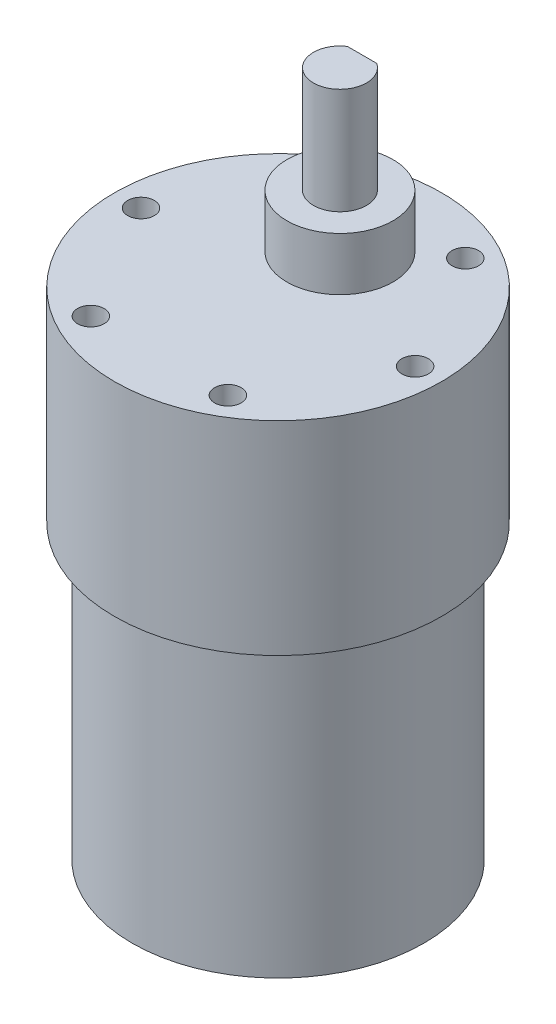
ISO-10303-21;
HEADER;
FILE_DESCRIPTION(('STEP AP214'),'2;1');
FILE_NAME('part.step','',(''),(''),'','','');
FILE_SCHEMA(('AUTOMOTIVE_DESIGN { 1 0 10303 214 1 1 1 1 }'));
ENDSEC;
DATA;
#1=APPLICATION_CONTEXT('core data for automotive mechanical design processes');
#2=APPLICATION_PROTOCOL_DEFINITION('international standard','automotive_design',2000,#1);
#3=PRODUCT_CONTEXT('',#1,'mechanical');
#4=PRODUCT('Part','Part','',(#3));
#5=PRODUCT_RELATED_PRODUCT_CATEGORY('part','',(#4));
#6=PRODUCT_DEFINITION_FORMATION('','',#4);
#7=PRODUCT_DEFINITION_CONTEXT('part definition',#1,'design');
#8=PRODUCT_DEFINITION('design','',#6,#7);
#9=PRODUCT_DEFINITION_SHAPE('','',#8);
#10=(LENGTH_UNIT() NAMED_UNIT(*) SI_UNIT(.MILLI.,.METRE.));
#11=(NAMED_UNIT(*) PLANE_ANGLE_UNIT() SI_UNIT($,.RADIAN.));
#12=(NAMED_UNIT(*) SI_UNIT($,.STERADIAN.) SOLID_ANGLE_UNIT());
#13=UNCERTAINTY_MEASURE_WITH_UNIT(LENGTH_MEASURE(1.E-05),#10,'distance_accuracy_value','');
#14=(GEOMETRIC_REPRESENTATION_CONTEXT(3) GLOBAL_UNCERTAINTY_ASSIGNED_CONTEXT((#13)) GLOBAL_UNIT_ASSIGNED_CONTEXT((#10,
#11,#12)) REPRESENTATION_CONTEXT('',''));
#15=CARTESIAN_POINT('',(0.,0.,0.));
#16=DIRECTION('',(0.,0.,1.));
#17=DIRECTION('',(1.,0.,0.));
#18=AXIS2_PLACEMENT_3D('',#15,#16,#17);
#19=CARTESIAN_POINT('',(0.,-33.,0.));
#20=DIRECTION('',(0.,1.,0.));
#21=DIRECTION('',(0.,0.,1.));
#22=AXIS2_PLACEMENT_3D('',#19,#20,#21);
#23=CYLINDRICAL_SURFACE('',#22,16.5);
#24=CARTESIAN_POINT('',(0.,-33.,0.));
#25=DIRECTION('',(0.,1.,0.));
#26=DIRECTION('',(0.,0.,1.));
#27=AXIS2_PLACEMENT_3D('',#24,#25,#26);
#28=CIRCLE('',#27,16.5);
#29=CARTESIAN_POINT('',(0.,-33.,16.5));
#30=VERTEX_POINT('',#29);
#31=EDGE_CURVE('E11',#30,#30,#28,.T.);
#32=ORIENTED_EDGE('',*,*,#31,.T.);
#33=EDGE_LOOP('',(#32));
#34=FACE_BOUND('',#33,.T.);
#35=CARTESIAN_POINT('',(0.,0.,0.));
#36=DIRECTION('',(0.,1.,0.));
#37=DIRECTION('',(0.,0.,1.));
#38=AXIS2_PLACEMENT_3D('',#35,#36,#37);
#39=CIRCLE('',#38,16.5);
#40=CARTESIAN_POINT('',(0.,0.,16.5));
#41=VERTEX_POINT('',#40);
#42=EDGE_CURVE('E45',#41,#41,#39,.T.);
#43=ORIENTED_EDGE('',*,*,#42,.F.);
#44=EDGE_LOOP('',(#43));
#45=FACE_BOUND('',#44,.T.);
#46=ADVANCED_FACE('F37',(#34,#45),#23,.T.);
#47=CARTESIAN_POINT('',(0.,-33.,0.));
#48=DIRECTION('',(0.,1.,0.));
#49=DIRECTION('',(0.,0.,1.));
#50=AXIS2_PLACEMENT_3D('',#47,#48,#49);
#51=PLANE('',#50);
#52=ORIENTED_EDGE('',*,*,#31,.F.);
#53=EDGE_LOOP('',(#52));
#54=FACE_BOUND('',#53,.T.);
#55=ADVANCED_FACE('F132',(#54),#51,.F.);
#56=CARTESIAN_POINT('',(0.,23.,0.));
#57=DIRECTION('',(0.,-1.,0.));
#58=DIRECTION('',(0.,0.,-1.));
#59=AXIS2_PLACEMENT_3D('',#56,#57,#58);
#60=CYLINDRICAL_SURFACE('',#59,18.5);
#61=CARTESIAN_POINT('',(0.,23.,0.));
#62=DIRECTION('',(0.,1.,0.));
#63=DIRECTION('',(0.,0.,1.));
#64=AXIS2_PLACEMENT_3D('',#61,#62,#63);
#65=CIRCLE('',#64,18.5);
#66=CARTESIAN_POINT('',(0.,23.,18.5));
#67=VERTEX_POINT('',#66);
#68=EDGE_CURVE('E121',#67,#67,#65,.T.);
#69=ORIENTED_EDGE('',*,*,#68,.F.);
#70=EDGE_LOOP('',(#69));
#71=FACE_BOUND('',#70,.T.);
#72=CARTESIAN_POINT('',(0.,0.,0.));
#73=DIRECTION('',(0.,1.,0.));
#74=DIRECTION('',(0.,0.,1.));
#75=AXIS2_PLACEMENT_3D('',#72,#73,#74);
#76=CIRCLE('',#75,18.5);
#77=CARTESIAN_POINT('',(0.,0.,18.5));
#78=VERTEX_POINT('',#77);
#79=EDGE_CURVE('E118',#78,#78,#76,.T.);
#80=ORIENTED_EDGE('',*,*,#79,.T.);
#81=EDGE_LOOP('',(#80));
#82=FACE_BOUND('',#81,.T.);
#83=ADVANCED_FACE('F137',(#71,#82),#60,.T.);
#84=CARTESIAN_POINT('',(0.,23.,0.));
#85=DIRECTION('',(0.,1.,0.));
#86=DIRECTION('',(0.,0.,1.));
#87=AXIS2_PLACEMENT_3D('',#84,#85,#86);
#88=PLANE('',#87);
#89=CARTESIAN_POINT('',(0.,23.,-7.));
#90=DIRECTION('',(0.,1.,0.));
#91=DIRECTION('',(0.,0.,1.));
#92=AXIS2_PLACEMENT_3D('',#89,#90,#91);
#93=CIRCLE('',#92,6.);
#94=CARTESIAN_POINT('',(0.,23.,-0.999999999999999));
#95=VERTEX_POINT('',#94);
#96=EDGE_CURVE('E86',#95,#95,#93,.T.);
#97=ORIENTED_EDGE('',*,*,#96,.F.);
#98=EDGE_LOOP('',(#97));
#99=FACE_BOUND('',#98,.T.);
#100=CARTESIAN_POINT('',(-15.4999999999996,23.,3.41722041537186E-13));
#101=DIRECTION('',(0.,1.,0.));
#102=DIRECTION('',(0.,0.,1.));
#103=AXIS2_PLACEMENT_3D('',#100,#101,#102);
#104=CIRCLE('',#103,1.50000000000039);
#105=CARTESIAN_POINT('',(-15.4999999999996,23.,1.50000000000073));
#106=VERTEX_POINT('',#105);
#107=EDGE_CURVE('E88',#106,#106,#104,.T.);
#108=ORIENTED_EDGE('',*,*,#107,.F.);
#109=EDGE_LOOP('',(#108));
#110=FACE_BOUND('',#109,.T.);
#111=CARTESIAN_POINT('',(-7.74999999999897,23.,13.423393758659));
#112=DIRECTION('',(0.,1.,0.));
#113=DIRECTION('',(0.,0.,1.));
#114=AXIS2_PLACEMENT_3D('',#111,#112,#113);
#115=CIRCLE('',#114,1.50000000000098);
#116=CARTESIAN_POINT('',(-7.74999999999897,23.,14.92339375866));
#117=VERTEX_POINT('',#116);
#118=EDGE_CURVE('E95',#117,#117,#115,.T.);
#119=ORIENTED_EDGE('',*,*,#118,.F.);
#120=EDGE_LOOP('',(#119));
#121=FACE_BOUND('',#120,.T.);
#122=CARTESIAN_POINT('',(7.75000000000124,23.,13.4233937586583));
#123=DIRECTION('',(0.,1.,0.));
#124=DIRECTION('',(0.,0.,1.));
#125=AXIS2_PLACEMENT_3D('',#122,#123,#124);
#126=CIRCLE('',#125,1.50000000000138);
#127=CARTESIAN_POINT('',(7.75000000000124,23.,14.9233937586597));
#128=VERTEX_POINT('',#127);
#129=EDGE_CURVE('E101',#128,#128,#126,.T.);
#130=ORIENTED_EDGE('',*,*,#129,.F.);
#131=EDGE_LOOP('',(#130));
#132=FACE_BOUND('',#131,.T.);
#133=CARTESIAN_POINT('',(15.5000000000008,23.,-9.78365557220674E-13));
#134=DIRECTION('',(0.,1.,0.));
#135=DIRECTION('',(0.,0.,1.));
#136=AXIS2_PLACEMENT_3D('',#133,#134,#135);
#137=CIRCLE('',#136,1.50000000000116);
#138=CARTESIAN_POINT('',(15.5000000000008,23.,1.50000000000018));
#139=VERTEX_POINT('',#138);
#140=EDGE_CURVE('E107',#139,#139,#137,.T.);
#141=ORIENTED_EDGE('',*,*,#140,.F.);
#142=EDGE_LOOP('',(#141));
#143=FACE_BOUND('',#142,.T.);
#144=CARTESIAN_POINT('',(7.7500000000001,23.,-13.4233937586596));
#145=DIRECTION('',(0.,1.,0.));
#146=DIRECTION('',(0.,0.,1.));
#147=AXIS2_PLACEMENT_3D('',#144,#145,#146);
#148=CIRCLE('',#147,1.50000000000048);
#149=CARTESIAN_POINT('',(7.7500000000001,23.,-11.9233937586591));
#150=VERTEX_POINT('',#149);
#151=EDGE_CURVE('E81',#150,#150,#148,.T.);
#152=ORIENTED_EDGE('',*,*,#151,.F.);
#153=EDGE_LOOP('',(#152));
#154=FACE_BOUND('',#153,.T.);
#155=CARTESIAN_POINT('',(-7.7500000000001,23.,-13.423393758659));
#156=DIRECTION('',(0.,1.,0.));
#157=DIRECTION('',(0.,0.,1.));
#158=AXIS2_PLACEMENT_3D('',#155,#156,#157);
#159=CIRCLE('',#158,1.5);
#160=CARTESIAN_POINT('',(-7.7500000000001,23.,-11.923393758659));
#161=VERTEX_POINT('',#160);
#162=EDGE_CURVE('E91',#161,#161,#159,.T.);
#163=ORIENTED_EDGE('',*,*,#162,.F.);
#164=EDGE_LOOP('',(#163));
#165=FACE_BOUND('',#164,.T.);
#166=ORIENTED_EDGE('',*,*,#68,.T.);
#167=EDGE_LOOP('',(#166));
#168=FACE_BOUND('',#167,.T.);
#169=ADVANCED_FACE('F143',(#99,#110,#121,#132,#143,#154,#165,#168),#88,.T.);
#170=CARTESIAN_POINT('',(0.,0.,0.));
#171=DIRECTION('',(0.,1.,0.));
#172=DIRECTION('',(0.,0.,1.));
#173=AXIS2_PLACEMENT_3D('',#170,#171,#172);
#174=PLANE('',#173);
#175=ORIENTED_EDGE('',*,*,#42,.T.);
#176=EDGE_LOOP('',(#175));
#177=FACE_BOUND('',#176,.T.);
#178=ORIENTED_EDGE('',*,*,#79,.F.);
#179=EDGE_LOOP('',(#178));
#180=FACE_BOUND('',#179,.T.);
#181=ADVANCED_FACE('F128',(#177,#180),#174,.F.);
#182=CARTESIAN_POINT('',(-7.7500000000001,20.5,-13.423393758659));
#183=DIRECTION('',(0.,1.,0.));
#184=DIRECTION('',(0.,0.,1.));
#185=AXIS2_PLACEMENT_3D('',#182,#183,#184);
#186=CYLINDRICAL_SURFACE('',#185,1.5);
#187=CARTESIAN_POINT('',(-7.7500000000001,20.5,-13.423393758659));
#188=DIRECTION('',(0.,1.,0.));
#189=DIRECTION('',(0.,0.,1.));
#190=AXIS2_PLACEMENT_3D('',#187,#188,#189);
#191=CIRCLE('',#190,1.5);
#192=CARTESIAN_POINT('',(-7.7500000000001,20.5,-11.923393758659));
#193=VERTEX_POINT('',#192);
#194=EDGE_CURVE('E115',#193,#193,#191,.T.);
#195=ORIENTED_EDGE('',*,*,#194,.F.);
#196=EDGE_LOOP('',(#195));
#197=FACE_BOUND('',#196,.T.);
#198=ORIENTED_EDGE('',*,*,#162,.T.);
#199=EDGE_LOOP('',(#198));
#200=FACE_BOUND('',#199,.T.);
#201=ADVANCED_FACE('F149',(#197,#200),#186,.F.);
#202=CARTESIAN_POINT('',(-7.7500000000001,20.5,-13.423393758659));
#203=DIRECTION('',(0.,1.,0.));
#204=DIRECTION('',(0.,0.,1.));
#205=AXIS2_PLACEMENT_3D('',#202,#203,#204);
#206=PLANE('',#205);
#207=ORIENTED_EDGE('',*,*,#194,.T.);
#208=EDGE_LOOP('',(#207));
#209=FACE_BOUND('',#208,.T.);
#210=ADVANCED_FACE('F155',(#209),#206,.T.);
#211=CARTESIAN_POINT('',(7.7500000000001,20.5,-13.4233937586596));
#212=DIRECTION('',(0.,1.,0.));
#213=DIRECTION('',(0.,0.,1.));
#214=AXIS2_PLACEMENT_3D('',#211,#212,#213);
#215=CYLINDRICAL_SURFACE('',#214,1.50000000000048);
#216=CARTESIAN_POINT('',(7.7500000000001,20.5,-13.4233937586596));
#217=DIRECTION('',(0.,1.,0.));
#218=DIRECTION('',(0.,0.,1.));
#219=AXIS2_PLACEMENT_3D('',#216,#217,#218);
#220=CIRCLE('',#219,1.50000000000048);
#221=CARTESIAN_POINT('',(7.7500000000001,20.5,-11.9233937586591));
#222=VERTEX_POINT('',#221);
#223=EDGE_CURVE('E78',#222,#222,#220,.T.);
#224=ORIENTED_EDGE('',*,*,#223,.F.);
#225=EDGE_LOOP('',(#224));
#226=FACE_BOUND('',#225,.T.);
#227=ORIENTED_EDGE('',*,*,#151,.T.);
#228=EDGE_LOOP('',(#227));
#229=FACE_BOUND('',#228,.T.);
#230=ADVANCED_FACE('F159',(#226,#229),#215,.F.);
#231=CARTESIAN_POINT('',(7.7500000000001,20.5,-13.4233937586596));
#232=DIRECTION('',(0.,1.,0.));
#233=DIRECTION('',(0.,0.,1.));
#234=AXIS2_PLACEMENT_3D('',#231,#232,#233);
#235=PLANE('',#234);
#236=ORIENTED_EDGE('',*,*,#223,.T.);
#237=EDGE_LOOP('',(#236));
#238=FACE_BOUND('',#237,.T.);
#239=ADVANCED_FACE('F161',(#238),#235,.T.);
#240=CARTESIAN_POINT('',(15.5000000000008,20.5,-9.78365557220674E-13));
#241=DIRECTION('',(0.,1.,0.));
#242=DIRECTION('',(0.,0.,1.));
#243=AXIS2_PLACEMENT_3D('',#240,#241,#242);
#244=CYLINDRICAL_SURFACE('',#243,1.50000000000116);
#245=CARTESIAN_POINT('',(15.5000000000008,20.5,-9.78365557220674E-13));
#246=DIRECTION('',(0.,1.,0.));
#247=DIRECTION('',(0.,0.,1.));
#248=AXIS2_PLACEMENT_3D('',#245,#246,#247);
#249=CIRCLE('',#248,1.50000000000116);
#250=CARTESIAN_POINT('',(15.5000000000008,20.5,1.50000000000018));
#251=VERTEX_POINT('',#250);
#252=EDGE_CURVE('E110',#251,#251,#249,.T.);
#253=ORIENTED_EDGE('',*,*,#252,.F.);
#254=EDGE_LOOP('',(#253));
#255=FACE_BOUND('',#254,.T.);
#256=ORIENTED_EDGE('',*,*,#140,.T.);
#257=EDGE_LOOP('',(#256));
#258=FACE_BOUND('',#257,.T.);
#259=ADVANCED_FACE('F164',(#255,#258),#244,.F.);
#260=CARTESIAN_POINT('',(15.5000000000008,20.5,-9.78365557220674E-13));
#261=DIRECTION('',(0.,1.,0.));
#262=DIRECTION('',(0.,0.,1.));
#263=AXIS2_PLACEMENT_3D('',#260,#261,#262);
#264=PLANE('',#263);
#265=ORIENTED_EDGE('',*,*,#252,.T.);
#266=EDGE_LOOP('',(#265));
#267=FACE_BOUND('',#266,.T.);
#268=ADVANCED_FACE('F169',(#267),#264,.T.);
#269=CARTESIAN_POINT('',(7.75000000000124,20.5,13.4233937586583));
#270=DIRECTION('',(0.,1.,0.));
#271=DIRECTION('',(0.,0.,1.));
#272=AXIS2_PLACEMENT_3D('',#269,#270,#271);
#273=CYLINDRICAL_SURFACE('',#272,1.50000000000138);
#274=CARTESIAN_POINT('',(7.75000000000124,20.5,13.4233937586583));
#275=DIRECTION('',(0.,1.,0.));
#276=DIRECTION('',(0.,0.,1.));
#277=AXIS2_PLACEMENT_3D('',#274,#275,#276);
#278=CIRCLE('',#277,1.50000000000138);
#279=CARTESIAN_POINT('',(7.75000000000124,20.5,14.9233937586597));
#280=VERTEX_POINT('',#279);
#281=EDGE_CURVE('E104',#280,#280,#278,.T.);
#282=ORIENTED_EDGE('',*,*,#281,.F.);
#283=EDGE_LOOP('',(#282));
#284=FACE_BOUND('',#283,.T.);
#285=ORIENTED_EDGE('',*,*,#129,.T.);
#286=EDGE_LOOP('',(#285));
#287=FACE_BOUND('',#286,.T.);
#288=ADVANCED_FACE('F172',(#284,#287),#273,.F.);
#289=CARTESIAN_POINT('',(7.75000000000124,20.5,13.4233937586583));
#290=DIRECTION('',(0.,1.,0.));
#291=DIRECTION('',(0.,0.,1.));
#292=AXIS2_PLACEMENT_3D('',#289,#290,#291);
#293=PLANE('',#292);
#294=ORIENTED_EDGE('',*,*,#281,.T.);
#295=EDGE_LOOP('',(#294));
#296=FACE_BOUND('',#295,.T.);
#297=ADVANCED_FACE('F177',(#296),#293,.T.);
#298=CARTESIAN_POINT('',(-7.74999999999897,20.5,13.423393758659));
#299=DIRECTION('',(0.,1.,0.));
#300=DIRECTION('',(0.,0.,1.));
#301=AXIS2_PLACEMENT_3D('',#298,#299,#300);
#302=CYLINDRICAL_SURFACE('',#301,1.50000000000098);
#303=CARTESIAN_POINT('',(-7.74999999999897,20.5,13.423393758659));
#304=DIRECTION('',(0.,1.,0.));
#305=DIRECTION('',(0.,0.,1.));
#306=AXIS2_PLACEMENT_3D('',#303,#304,#305);
#307=CIRCLE('',#306,1.50000000000098);
#308=CARTESIAN_POINT('',(-7.74999999999897,20.5,14.92339375866));
#309=VERTEX_POINT('',#308);
#310=EDGE_CURVE('E98',#309,#309,#307,.T.);
#311=ORIENTED_EDGE('',*,*,#310,.F.);
#312=EDGE_LOOP('',(#311));
#313=FACE_BOUND('',#312,.T.);
#314=ORIENTED_EDGE('',*,*,#118,.T.);
#315=EDGE_LOOP('',(#314));
#316=FACE_BOUND('',#315,.T.);
#317=ADVANCED_FACE('F180',(#313,#316),#302,.F.);
#318=CARTESIAN_POINT('',(-7.74999999999897,20.5,13.423393758659));
#319=DIRECTION('',(0.,1.,0.));
#320=DIRECTION('',(0.,0.,1.));
#321=AXIS2_PLACEMENT_3D('',#318,#319,#320);
#322=PLANE('',#321);
#323=ORIENTED_EDGE('',*,*,#310,.T.);
#324=EDGE_LOOP('',(#323));
#325=FACE_BOUND('',#324,.T.);
#326=ADVANCED_FACE('F185',(#325),#322,.T.);
#327=CARTESIAN_POINT('',(-15.4999999999996,20.5,3.41722041537186E-13));
#328=DIRECTION('',(0.,1.,0.));
#329=DIRECTION('',(0.,0.,1.));
#330=AXIS2_PLACEMENT_3D('',#327,#328,#329);
#331=CYLINDRICAL_SURFACE('',#330,1.50000000000039);
#332=CARTESIAN_POINT('',(-15.4999999999996,20.5,3.41722041537186E-13));
#333=DIRECTION('',(0.,1.,0.));
#334=DIRECTION('',(0.,0.,1.));
#335=AXIS2_PLACEMENT_3D('',#332,#333,#334);
#336=CIRCLE('',#335,1.50000000000039);
#337=CARTESIAN_POINT('',(-15.4999999999996,20.5,1.50000000000073));
#338=VERTEX_POINT('',#337);
#339=EDGE_CURVE('E92',#338,#338,#336,.T.);
#340=ORIENTED_EDGE('',*,*,#339,.F.);
#341=EDGE_LOOP('',(#340));
#342=FACE_BOUND('',#341,.T.);
#343=ORIENTED_EDGE('',*,*,#107,.T.);
#344=EDGE_LOOP('',(#343));
#345=FACE_BOUND('',#344,.T.);
#346=ADVANCED_FACE('F188',(#342,#345),#331,.F.);
#347=CARTESIAN_POINT('',(-15.4999999999996,20.5,3.41722041537186E-13));
#348=DIRECTION('',(0.,1.,0.));
#349=DIRECTION('',(0.,0.,1.));
#350=AXIS2_PLACEMENT_3D('',#347,#348,#349);
#351=PLANE('',#350);
#352=ORIENTED_EDGE('',*,*,#339,.T.);
#353=EDGE_LOOP('',(#352));
#354=FACE_BOUND('',#353,.T.);
#355=ADVANCED_FACE('F193',(#354),#351,.T.);
#356=CARTESIAN_POINT('',(0.,29.,-7.));
#357=DIRECTION('',(0.,-1.,0.));
#358=DIRECTION('',(0.,0.,-1.));
#359=AXIS2_PLACEMENT_3D('',#356,#357,#358);
#360=CYLINDRICAL_SURFACE('',#359,6.);
#361=CARTESIAN_POINT('',(0.,29.,-7.));
#362=DIRECTION('',(0.,1.,0.));
#363=DIRECTION('',(0.,0.,1.));
#364=AXIS2_PLACEMENT_3D('',#361,#362,#363);
#365=CIRCLE('',#364,6.);
#366=CARTESIAN_POINT('',(0.,29.,-0.999999999999999));
#367=VERTEX_POINT('',#366);
#368=EDGE_CURVE('E83',#367,#367,#365,.T.);
#369=ORIENTED_EDGE('',*,*,#368,.F.);
#370=EDGE_LOOP('',(#369));
#371=FACE_BOUND('',#370,.T.);
#372=ORIENTED_EDGE('',*,*,#96,.T.);
#373=EDGE_LOOP('',(#372));
#374=FACE_BOUND('',#373,.T.);
#375=ADVANCED_FACE('F196',(#371,#374),#360,.T.);
#376=CARTESIAN_POINT('',(0.,29.,-7.));
#377=DIRECTION('',(0.,1.,0.));
#378=DIRECTION('',(0.,0.,1.));
#379=AXIS2_PLACEMENT_3D('',#376,#377,#378);
#380=PLANE('',#379);
#381=CARTESIAN_POINT('',(0.,29.,-7.));
#382=DIRECTION('',(0.,1.,0.));
#383=DIRECTION('',(0.,0.,1.));
#384=AXIS2_PLACEMENT_3D('',#381,#382,#383);
#385=CIRCLE('',#384,3.);
#386=CARTESIAN_POINT('',(-1.6583123951777,29.,-9.5));
#387=VERTEX_POINT('',#386);
#388=CARTESIAN_POINT('',(1.6583123951777,29.,-9.5));
#389=VERTEX_POINT('',#388);
#390=EDGE_CURVE('E40',#387,#389,#385,.T.);
#391=ORIENTED_EDGE('',*,*,#390,.F.);
#392=DIRECTION('',(1.,0.,0.));
#393=VECTOR('',#392,1.);
#394=CARTESIAN_POINT('',(-1.6583123951777,29.,-9.5));
#395=LINE('',#394,#393);
#396=EDGE_CURVE('E52',#387,#389,#395,.T.);
#397=ORIENTED_EDGE('',*,*,#396,.T.);
#398=EDGE_LOOP('',(#391,#397));
#399=FACE_BOUND('',#398,.T.);
#400=ORIENTED_EDGE('',*,*,#368,.T.);
#401=EDGE_LOOP('',(#400));
#402=FACE_BOUND('',#401,.T.);
#403=ADVANCED_FACE('F205',(#399,#402),#380,.T.);
#404=CARTESIAN_POINT('',(0.,41.,-7.));
#405=DIRECTION('',(0.,1.,0.));
#406=DIRECTION('',(0.,0.,1.));
#407=AXIS2_PLACEMENT_3D('',#404,#405,#406);
#408=PLANE('',#407);
#409=DIRECTION('',(1.,0.,0.));
#410=VECTOR('',#409,1.);
#411=CARTESIAN_POINT('',(-1.6583123951777,41.,-9.5));
#412=LINE('',#411,#410);
#413=CARTESIAN_POINT('',(-1.6583123951777,41.,-9.5));
#414=VERTEX_POINT('',#413);
#415=CARTESIAN_POINT('',(1.6583123951777,41.,-9.5));
#416=VERTEX_POINT('',#415);
#417=EDGE_CURVE('E65',#414,#416,#412,.T.);
#418=ORIENTED_EDGE('',*,*,#417,.F.);
#419=CARTESIAN_POINT('',(0.,41.,-7.));
#420=DIRECTION('',(0.,1.,0.));
#421=DIRECTION('',(0.,0.,1.));
#422=AXIS2_PLACEMENT_3D('',#419,#420,#421);
#423=CIRCLE('',#422,3.);
#424=EDGE_CURVE('E75',#414,#416,#423,.T.);
#425=ORIENTED_EDGE('',*,*,#424,.T.);
#426=EDGE_LOOP('',(#418,#425));
#427=FACE_BOUND('',#426,.T.);
#428=ADVANCED_FACE('F74',(#427),#408,.T.);
#429=CARTESIAN_POINT('',(0.,41.,-7.));
#430=DIRECTION('',(0.,-1.,0.));
#431=DIRECTION('',(0.,0.,-1.));
#432=AXIS2_PLACEMENT_3D('',#429,#430,#431);
#433=CYLINDRICAL_SURFACE('',#432,3.);
#434=ORIENTED_EDGE('',*,*,#424,.F.);
#435=DIRECTION('',(0.,1.,0.));
#436=VECTOR('',#435,1.);
#437=CARTESIAN_POINT('',(-1.6583123951777,29.,-9.5));
#438=LINE('',#437,#436);
#439=EDGE_CURVE('E62',#387,#414,#438,.T.);
#440=ORIENTED_EDGE('',*,*,#439,.F.);
#441=ORIENTED_EDGE('',*,*,#390,.T.);
#442=DIRECTION('',(0.,1.,0.));
#443=VECTOR('',#442,1.);
#444=CARTESIAN_POINT('',(1.6583123951777,29.,-9.5));
#445=LINE('',#444,#443);
#446=EDGE_CURVE('E70',#389,#416,#445,.T.);
#447=ORIENTED_EDGE('',*,*,#446,.T.);
#448=EDGE_LOOP('',(#434,#440,#441,#447));
#449=FACE_BOUND('',#448,.T.);
#450=ADVANCED_FACE('F77',(#449),#433,.T.);
#451=CARTESIAN_POINT('',(-1.6583123951777,29.,-9.5));
#452=DIRECTION('',(0.,0.,1.));
#453=DIRECTION('',(1.,0.,0.));
#454=AXIS2_PLACEMENT_3D('',#451,#452,#453);
#455=PLANE('',#454);
#456=ORIENTED_EDGE('',*,*,#417,.T.);
#457=ORIENTED_EDGE('',*,*,#446,.F.);
#458=ORIENTED_EDGE('',*,*,#396,.F.);
#459=ORIENTED_EDGE('',*,*,#439,.T.);
#460=EDGE_LOOP('',(#456,#457,#458,#459));
#461=FACE_BOUND('',#460,.T.);
#462=ADVANCED_FACE('F64',(#461),#455,.F.);
#463=CLOSED_SHELL('',(#46,#55,#83,#169,#181,#201,#210,#230,#239,#259,#268,#288,#297,#317,#326,
#346,#355,#375,#403,#428,#450,#462));
#464=MANIFOLD_SOLID_BREP('B2',#463);
#465=ADVANCED_BREP_SHAPE_REPRESENTATION('',(#18,#464),#14);
#466=SHAPE_DEFINITION_REPRESENTATION(#9,#465);
ENDSEC;
END-ISO-10303-21;
